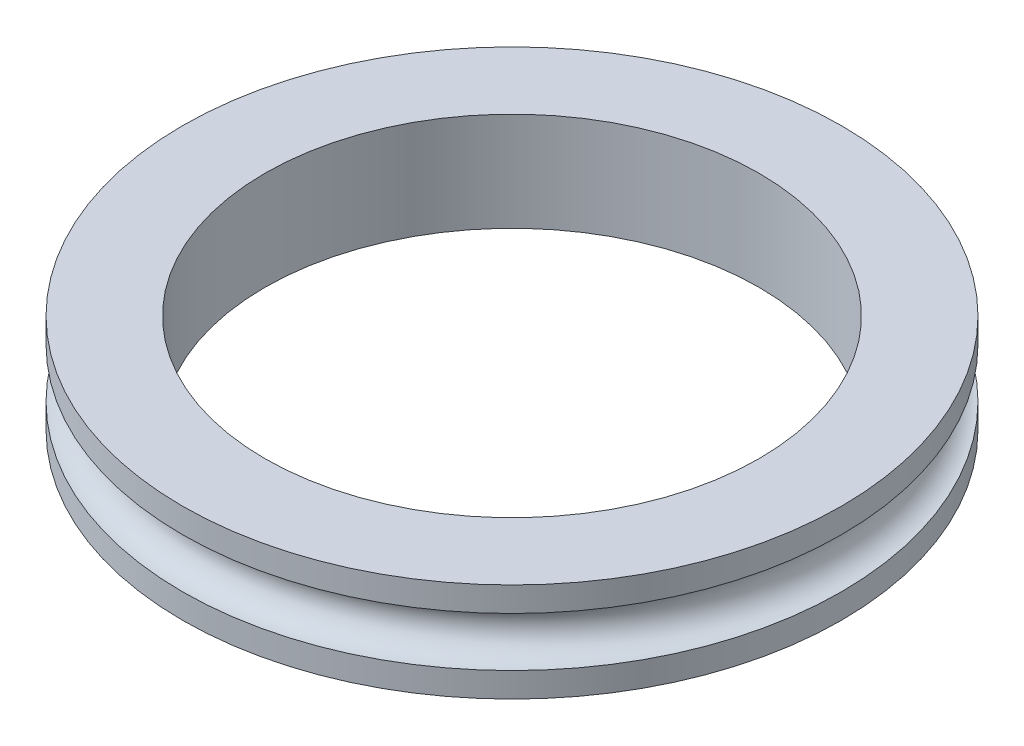
ISO-10303-21;
HEADER;
FILE_DESCRIPTION(('STEP AP214'),'2;1');
FILE_NAME('part.step','',(''),(''),'','','');
FILE_SCHEMA(('AUTOMOTIVE_DESIGN { 1 0 10303 214 1 1 1 1 }'));
ENDSEC;
DATA;
#1=APPLICATION_CONTEXT('core data for automotive mechanical design processes');
#2=APPLICATION_PROTOCOL_DEFINITION('international standard','automotive_design',2000,#1);
#3=PRODUCT_CONTEXT('',#1,'mechanical');
#4=PRODUCT('Part','Part','',(#3));
#5=PRODUCT_RELATED_PRODUCT_CATEGORY('part','',(#4));
#6=PRODUCT_DEFINITION_FORMATION('','',#4);
#7=PRODUCT_DEFINITION_CONTEXT('part definition',#1,'design');
#8=PRODUCT_DEFINITION('design','',#6,#7);
#9=PRODUCT_DEFINITION_SHAPE('','',#8);
#10=(LENGTH_UNIT() NAMED_UNIT(*) SI_UNIT(.MILLI.,.METRE.));
#11=(NAMED_UNIT(*) PLANE_ANGLE_UNIT() SI_UNIT($,.RADIAN.));
#12=(NAMED_UNIT(*) SI_UNIT($,.STERADIAN.) SOLID_ANGLE_UNIT());
#13=UNCERTAINTY_MEASURE_WITH_UNIT(LENGTH_MEASURE(1.E-05),#10,'distance_accuracy_value','');
#14=(GEOMETRIC_REPRESENTATION_CONTEXT(3) GLOBAL_UNCERTAINTY_ASSIGNED_CONTEXT((#13)) GLOBAL_UNIT_ASSIGNED_CONTEXT((#10,
#11,#12)) REPRESENTATION_CONTEXT('',''));
#15=CARTESIAN_POINT('',(0.,0.,0.));
#16=DIRECTION('',(0.,0.,1.));
#17=DIRECTION('',(1.,0.,0.));
#18=AXIS2_PLACEMENT_3D('',#15,#16,#17);
#19=CARTESIAN_POINT('',(0.,3.,0.));
#20=DIRECTION('',(0.,-1.,0.));
#21=DIRECTION('',(0.,0.,-1.));
#22=AXIS2_PLACEMENT_3D('',#19,#20,#21);
#23=CYLINDRICAL_SURFACE('',#22,10.);
#24=CARTESIAN_POINT('',(0.,3.,0.));
#25=DIRECTION('',(0.,1.,0.));
#26=DIRECTION('',(0.,0.,1.));
#27=AXIS2_PLACEMENT_3D('',#24,#25,#26);
#28=CIRCLE('',#27,10.);
#29=CARTESIAN_POINT('',(0.,3.,10.));
#30=VERTEX_POINT('',#29);
#31=EDGE_CURVE('E10',#30,#30,#28,.T.);
#32=ORIENTED_EDGE('',*,*,#31,.F.);
#33=EDGE_LOOP('',(#32));
#34=FACE_BOUND('',#33,.T.);
#35=CARTESIAN_POINT('',(0.,2.25,0.));
#36=DIRECTION('',(0.,-1.,0.));
#37=DIRECTION('',(0.,0.,-1.));
#38=AXIS2_PLACEMENT_3D('',#35,#36,#37);
#39=CIRCLE('',#38,10.);
#40=CARTESIAN_POINT('',(0.,2.25,-10.));
#41=VERTEX_POINT('',#40);
#42=EDGE_CURVE('E34',#41,#41,#39,.T.);
#43=ORIENTED_EDGE('',*,*,#42,.F.);
#44=EDGE_LOOP('',(#43));
#45=FACE_BOUND('',#44,.T.);
#46=ADVANCED_FACE('F31',(#34,#45),#23,.T.);
#47=CARTESIAN_POINT('',(0.,3.,0.));
#48=DIRECTION('',(0.,1.,0.));
#49=DIRECTION('',(0.,0.,1.));
#50=AXIS2_PLACEMENT_3D('',#47,#48,#49);
#51=PLANE('',#50);
#52=CARTESIAN_POINT('',(0.,3.,0.));
#53=DIRECTION('',(0.,-1.,0.));
#54=DIRECTION('',(0.,0.,-1.));
#55=AXIS2_PLACEMENT_3D('',#52,#53,#54);
#56=CIRCLE('',#55,7.5);
#57=CARTESIAN_POINT('',(0.,3.,-7.5));
#58=VERTEX_POINT('',#57);
#59=EDGE_CURVE('E49',#58,#58,#56,.T.);
#60=ORIENTED_EDGE('',*,*,#59,.T.);
#61=EDGE_LOOP('',(#60));
#62=FACE_BOUND('',#61,.T.);
#63=ORIENTED_EDGE('',*,*,#31,.T.);
#64=EDGE_LOOP('',(#63));
#65=FACE_BOUND('',#64,.T.);
#66=ADVANCED_FACE('F76',(#62,#65),#51,.T.);
#67=CARTESIAN_POINT('',(0.,1.5,0.));
#68=DIRECTION('',(0.,1.,0.));
#69=DIRECTION('',(0.,0.,1.));
#70=AXIS2_PLACEMENT_3D('',#67,#68,#69);
#71=TOROIDAL_SURFACE('',#70,10.,0.75);
#72=CARTESIAN_POINT('',(0.,0.75,0.));
#73=DIRECTION('',(0.,1.,0.));
#74=DIRECTION('',(0.,0.,1.));
#75=AXIS2_PLACEMENT_3D('',#72,#73,#74);
#76=CIRCLE('',#75,10.);
#77=CARTESIAN_POINT('',(0.,0.75,10.));
#78=VERTEX_POINT('',#77);
#79=EDGE_CURVE('E47',#78,#78,#76,.T.);
#80=ORIENTED_EDGE('',*,*,#79,.T.);
#81=EDGE_LOOP('',(#80));
#82=FACE_BOUND('',#81,.T.);
#83=ORIENTED_EDGE('',*,*,#42,.T.);
#84=EDGE_LOOP('',(#83));
#85=FACE_BOUND('',#84,.T.);
#86=ADVANCED_FACE('F65',(#82,#85),#71,.F.);
#87=CARTESIAN_POINT('',(0.,0.,0.));
#88=DIRECTION('',(0.,1.,0.));
#89=DIRECTION('',(0.,0.,1.));
#90=AXIS2_PLACEMENT_3D('',#87,#88,#89);
#91=PLANE('',#90);
#92=CARTESIAN_POINT('',(0.,0.,0.));
#93=DIRECTION('',(0.,-1.,0.));
#94=DIRECTION('',(0.,0.,-1.));
#95=AXIS2_PLACEMENT_3D('',#92,#93,#94);
#96=CIRCLE('',#95,7.5);
#97=CARTESIAN_POINT('',(0.,0.,-7.5));
#98=VERTEX_POINT('',#97);
#99=EDGE_CURVE('E45',#98,#98,#96,.T.);
#100=ORIENTED_EDGE('',*,*,#99,.F.);
#101=EDGE_LOOP('',(#100));
#102=FACE_BOUND('',#101,.T.);
#103=CARTESIAN_POINT('',(0.,0.,0.));
#104=DIRECTION('',(0.,1.,0.));
#105=DIRECTION('',(0.,0.,1.));
#106=AXIS2_PLACEMENT_3D('',#103,#104,#105);
#107=CIRCLE('',#106,10.);
#108=CARTESIAN_POINT('',(0.,0.,10.));
#109=VERTEX_POINT('',#108);
#110=EDGE_CURVE('E38',#109,#109,#107,.T.);
#111=ORIENTED_EDGE('',*,*,#110,.F.);
#112=EDGE_LOOP('',(#111));
#113=FACE_BOUND('',#112,.T.);
#114=ADVANCED_FACE('F61',(#102,#113),#91,.F.);
#115=ORIENTED_EDGE('',*,*,#110,.T.);
#116=EDGE_LOOP('',(#115));
#117=FACE_BOUND('',#116,.T.);
#118=ORIENTED_EDGE('',*,*,#79,.F.);
#119=EDGE_LOOP('',(#118));
#120=FACE_BOUND('',#119,.T.);
#121=ADVANCED_FACE('F64',(#117,#120),#23,.T.);
#122=CARTESIAN_POINT('',(0.,3.,0.));
#123=DIRECTION('',(0.,-1.,0.));
#124=DIRECTION('',(0.,0.,-1.));
#125=AXIS2_PLACEMENT_3D('',#122,#123,#124);
#126=CYLINDRICAL_SURFACE('',#125,7.5);
#127=ORIENTED_EDGE('',*,*,#59,.F.);
#128=EDGE_LOOP('',(#127));
#129=FACE_BOUND('',#128,.T.);
#130=ORIENTED_EDGE('',*,*,#99,.T.);
#131=EDGE_LOOP('',(#130));
#132=FACE_BOUND('',#131,.T.);
#133=ADVANCED_FACE('F59',(#129,#132),#126,.F.);
#134=CLOSED_SHELL('',(#46,#66,#86,#114,#121,#133));
#135=MANIFOLD_SOLID_BREP('B2',#134);
#136=ADVANCED_BREP_SHAPE_REPRESENTATION('',(#18,#135),#14);
#137=SHAPE_DEFINITION_REPRESENTATION(#9,#136);
ENDSEC;
END-ISO-10303-21;
